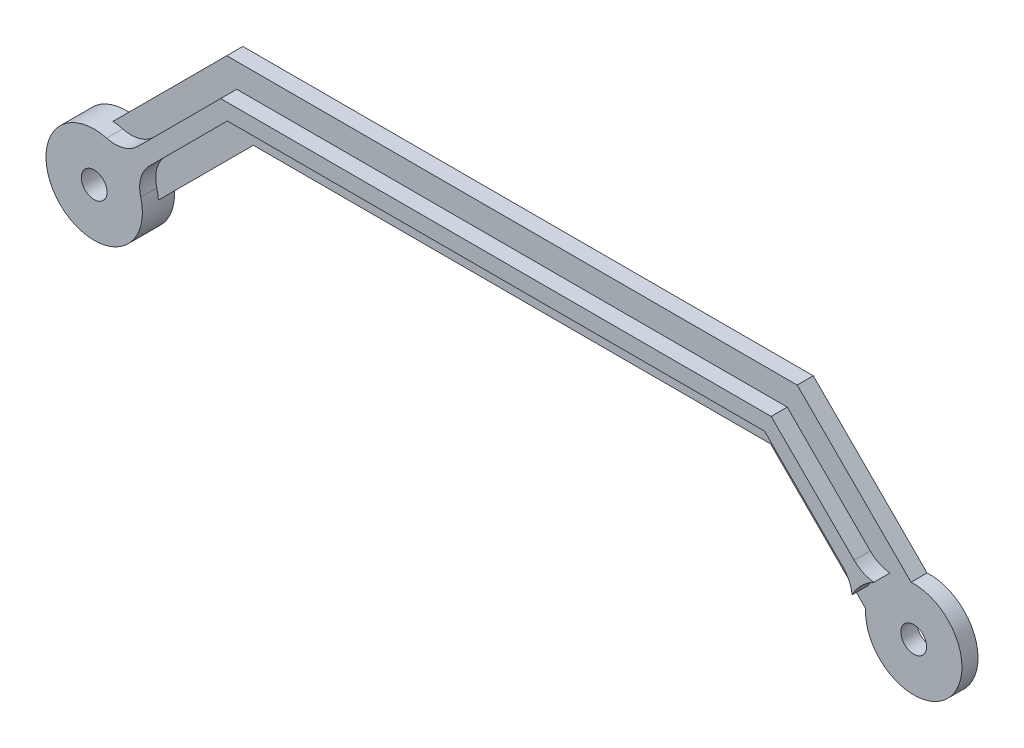
ISO-10303-21;
HEADER;
FILE_DESCRIPTION(('STEP AP214'),'2;1');
FILE_NAME('part.step','',(''),(''),'','','');
FILE_SCHEMA(('AUTOMOTIVE_DESIGN { 1 0 10303 214 1 1 1 1 }'));
ENDSEC;
DATA;
#1=APPLICATION_CONTEXT('core data for automotive mechanical design processes');
#2=APPLICATION_PROTOCOL_DEFINITION('international standard','automotive_design',2000,#1);
#3=PRODUCT_CONTEXT('',#1,'mechanical');
#4=PRODUCT('Part','Part','',(#3));
#5=PRODUCT_RELATED_PRODUCT_CATEGORY('part','',(#4));
#6=PRODUCT_DEFINITION_FORMATION('','',#4);
#7=PRODUCT_DEFINITION_CONTEXT('part definition',#1,'design');
#8=PRODUCT_DEFINITION('design','',#6,#7);
#9=PRODUCT_DEFINITION_SHAPE('','',#8);
#10=(LENGTH_UNIT() NAMED_UNIT(*) SI_UNIT(.MILLI.,.METRE.));
#11=(NAMED_UNIT(*) PLANE_ANGLE_UNIT() SI_UNIT($,.RADIAN.));
#12=(NAMED_UNIT(*) SI_UNIT($,.STERADIAN.) SOLID_ANGLE_UNIT());
#13=UNCERTAINTY_MEASURE_WITH_UNIT(LENGTH_MEASURE(1.E-05),#10,'distance_accuracy_value','');
#14=(GEOMETRIC_REPRESENTATION_CONTEXT(3) GLOBAL_UNCERTAINTY_ASSIGNED_CONTEXT((#13)) GLOBAL_UNIT_ASSIGNED_CONTEXT((#10,
#11,#12)) REPRESENTATION_CONTEXT('',''));
#15=CARTESIAN_POINT('',(0.,0.,0.));
#16=DIRECTION('',(0.,0.,1.));
#17=DIRECTION('',(1.,0.,0.));
#18=AXIS2_PLACEMENT_3D('',#15,#16,#17);
#19=CARTESIAN_POINT('',(250.,0.,5.));
#20=DIRECTION('',(0.,0.,-1.));
#21=DIRECTION('',(-1.,0.,0.));
#22=AXIS2_PLACEMENT_3D('',#19,#20,#21);
#23=CYLINDRICAL_SURFACE('',#22,15.);
#24=CARTESIAN_POINT('',(250.,0.,5.));
#25=DIRECTION('',(0.,0.,1.));
#26=DIRECTION('',(1.,0.,0.));
#27=AXIS2_PLACEMENT_3D('',#24,#25,#26);
#28=CIRCLE('',#27,15.);
#29=CARTESIAN_POINT('',(235.023238037714,0.83462633855539,5.));
#30=VERTEX_POINT('',#29);
#31=CARTESIAN_POINT('',(249.165373661444,14.9767619622864,5.));
#32=VERTEX_POINT('',#31);
#33=EDGE_CURVE('E329',#30,#32,#28,.T.);
#34=ORIENTED_EDGE('',*,*,#33,.F.);
#35=DIRECTION('',(0.,0.,-1.));
#36=VECTOR('',#35,1.);
#37=CARTESIAN_POINT('',(235.023238037714,0.83462633855539,5.));
#38=LINE('',#37,#36);
#39=CARTESIAN_POINT('',(235.023238037714,0.83462633855539,0.));
#40=VERTEX_POINT('',#39);
#41=EDGE_CURVE('E223',#30,#40,#38,.T.);
#42=ORIENTED_EDGE('',*,*,#41,.T.);
#43=CARTESIAN_POINT('',(250.,0.,0.));
#44=DIRECTION('',(0.,0.,1.));
#45=DIRECTION('',(-1.,0.,0.));
#46=AXIS2_PLACEMENT_3D('',#43,#44,#45);
#47=CIRCLE('',#46,15.);
#48=CARTESIAN_POINT('',(249.165373661444,14.9767619622864,0.));
#49=VERTEX_POINT('',#48);
#50=EDGE_CURVE('E256',#40,#49,#47,.T.);
#51=ORIENTED_EDGE('',*,*,#50,.T.);
#52=DIRECTION('',(0.,0.,-1.));
#53=VECTOR('',#52,1.);
#54=CARTESIAN_POINT('',(249.165373661444,14.9767619622864,5.));
#55=LINE('',#54,#53);
#56=EDGE_CURVE('E226',#32,#49,#55,.T.);
#57=ORIENTED_EDGE('',*,*,#56,.F.);
#58=EDGE_LOOP('',(#34,#42,#51,#57));
#59=FACE_BOUND('',#58,.T.);
#60=ADVANCED_FACE('F37',(#59),#23,.T.);
#61=CARTESIAN_POINT('',(250.,0.,5.));
#62=DIRECTION('',(0.,0.,-1.));
#63=DIRECTION('',(-1.,0.,0.));
#64=AXIS2_PLACEMENT_3D('',#61,#62,#63);
#65=CYLINDRICAL_SURFACE('',#64,3.99999999999999);
#66=CARTESIAN_POINT('',(250.,0.,0.));
#67=DIRECTION('',(0.,0.,1.));
#68=DIRECTION('',(1.,0.,0.));
#69=AXIS2_PLACEMENT_3D('',#66,#67,#68);
#70=CIRCLE('',#69,3.99999999999999);
#71=CARTESIAN_POINT('',(254.,0.,0.));
#72=VERTEX_POINT('',#71);
#73=EDGE_CURVE('E278',#72,#72,#70,.T.);
#74=ORIENTED_EDGE('',*,*,#73,.F.);
#75=EDGE_LOOP('',(#74));
#76=FACE_BOUND('',#75,.T.);
#77=CARTESIAN_POINT('',(250.,0.,5.));
#78=DIRECTION('',(0.,0.,1.));
#79=DIRECTION('',(1.,0.,0.));
#80=AXIS2_PLACEMENT_3D('',#77,#78,#79);
#81=CIRCLE('',#80,3.99999999999999);
#82=CARTESIAN_POINT('',(254.,0.,5.));
#83=VERTEX_POINT('',#82);
#84=EDGE_CURVE('E330',#83,#83,#81,.T.);
#85=ORIENTED_EDGE('',*,*,#84,.T.);
#86=EDGE_LOOP('',(#85));
#87=FACE_BOUND('',#86,.T.);
#88=ADVANCED_FACE('F413',(#76,#87),#65,.F.);
#89=CARTESIAN_POINT('',(250.,0.,5.));
#90=DIRECTION('',(0.,0.,-1.));
#91=DIRECTION('',(-1.,0.,0.));
#92=AXIS2_PLACEMENT_3D('',#89,#90,#91);
#93=PLANE('',#92);
#94=DIRECTION('',(0.707106781186551,-0.707106781186544,0.));
#95=VECTOR('',#94,1.);
#96=CARTESIAN_POINT('',(205.460749769071,30.3971146071979,5.));
#97=LINE('',#96,#95);
#98=CARTESIAN_POINT('',(205.460749769071,30.3971146071979,5.));
#99=VERTEX_POINT('',#98);
#100=EDGE_CURVE('E272',#99,#30,#97,.T.);
#101=ORIENTED_EDGE('',*,*,#100,.T.);
#102=ORIENTED_EDGE('',*,*,#33,.T.);
#103=DIRECTION('',(-0.707106781186552,0.707106781186543,0.));
#104=VECTOR('',#103,1.);
#105=CARTESIAN_POINT('',(249.165373661444,14.9767619622864,5.));
#106=LINE('',#105,#104);
#107=CARTESIAN_POINT('',(213.745021016531,50.397114607199,5.));
#108=VERTEX_POINT('',#107);
#109=EDGE_CURVE('E270',#32,#108,#106,.T.);
#110=ORIENTED_EDGE('',*,*,#109,.T.);
#111=DIRECTION('',(-1.,0.,0.));
#112=VECTOR('',#111,1.);
#113=CARTESIAN_POINT('',(36.2549789834685,50.397114607199,5.));
#114=LINE('',#113,#112);
#115=CARTESIAN_POINT('',(36.2549789834685,50.397114607199,5.));
#116=VERTEX_POINT('',#115);
#117=EDGE_CURVE('E268',#108,#116,#114,.T.);
#118=ORIENTED_EDGE('',*,*,#117,.T.);
#119=DIRECTION('',(-0.707106781186551,-0.707106781186544,0.));
#120=VECTOR('',#119,1.);
#121=CARTESIAN_POINT('',(0.834626338555555,14.9767619622864,5.));
#122=LINE('',#121,#120);
#123=CARTESIAN_POINT('',(0.834626338555554,14.9767619622864,5.));
#124=VERTEX_POINT('',#123);
#125=EDGE_CURVE('E265',#116,#124,#122,.T.);
#126=ORIENTED_EDGE('',*,*,#125,.T.);
#127=CARTESIAN_POINT('',(0.,0.,5.));
#128=DIRECTION('',(0.,0.,1.));
#129=DIRECTION('',(1.,0.,0.));
#130=AXIS2_PLACEMENT_3D('',#127,#128,#129);
#131=CIRCLE('',#130,15.);
#132=CARTESIAN_POINT('',(3.88228567653788,14.488887394336,5.));
#133=VERTEX_POINT('',#132);
#134=EDGE_CURVE('E322',#133,#124,#131,.T.);
#135=ORIENTED_EDGE('',*,*,#134,.F.);
#136=CARTESIAN_POINT('',(6.47047612756314,24.1481456572267,5.));
#137=DIRECTION('',(0.,0.,-1.));
#138=DIRECTION('',(-1.,0.,0.));
#139=AXIS2_PLACEMENT_3D('',#136,#137,#138);
#140=CIRCLE('',#139,10.);
#141=CARTESIAN_POINT('',(13.5415439394286,17.0770778453612,5.));
#142=VERTEX_POINT('',#141);
#143=EDGE_CURVE('E211',#133,#142,#140,.F.);
#144=ORIENTED_EDGE('',*,*,#143,.T.);
#145=DIRECTION('',(-0.707106781186551,-0.707106781186544,0.));
#146=VECTOR('',#145,1.);
#147=CARTESIAN_POINT('',(39.3615807012659,42.8971146071982,5.));
#148=LINE('',#147,#146);
#149=CARTESIAN_POINT('',(39.3615807012659,42.8971146071982,5.));
#150=VERTEX_POINT('',#149);
#151=EDGE_CURVE('E302',#150,#142,#148,.T.);
#152=ORIENTED_EDGE('',*,*,#151,.F.);
#153=DIRECTION('',(-1.,0.,0.));
#154=VECTOR('',#153,1.);
#155=CARTESIAN_POINT('',(210.638419298733,42.897114607199,5.));
#156=LINE('',#155,#154);
#157=CARTESIAN_POINT('',(210.638419298733,42.897114607199,5.));
#158=VERTEX_POINT('',#157);
#159=EDGE_CURVE('E304',#158,#150,#156,.T.);
#160=ORIENTED_EDGE('',*,*,#159,.F.);
#161=DIRECTION('',(-0.707106781186552,0.707106781186543,0.));
#162=VECTOR('',#161,1.);
#163=CARTESIAN_POINT('',(243.862072802545,9.67346110338729,5.));
#164=LINE('',#163,#162);
#165=CARTESIAN_POINT('',(236.458456060571,17.0770778453612,5.));
#166=VERTEX_POINT('',#165);
#167=EDGE_CURVE('E306',#166,#158,#164,.T.);
#168=ORIENTED_EDGE('',*,*,#167,.F.);
#169=CARTESIAN_POINT('',(243.529523872437,24.1481456572267,5.));
#170=DIRECTION('',(0.,0.,-1.));
#171=DIRECTION('',(-1.,0.,0.));
#172=AXIS2_PLACEMENT_3D('',#169,#170,#171);
#173=CIRCLE('',#172,10.);
#174=CARTESIAN_POINT('',(242.609007064555,14.1906033496888,5.));
#175=VERTEX_POINT('',#174);
#176=EDGE_CURVE('E209',#166,#175,#173,.F.);
#177=ORIENTED_EDGE('',*,*,#176,.T.);
#178=CARTESIAN_POINT('',(250.,0.,5.));
#179=DIRECTION('',(0.,0.,1.));
#180=DIRECTION('',(1.,0.,0.));
#181=AXIS2_PLACEMENT_3D('',#178,#179,#180);
#182=CIRCLE('',#181,16.);
#183=CARTESIAN_POINT('',(235.809396650311,7.39099293544512,5.));
#184=VERTEX_POINT('',#183);
#185=EDGE_CURVE('E178',#175,#184,#182,.T.);
#186=ORIENTED_EDGE('',*,*,#185,.T.);
#187=CARTESIAN_POINT('',(225.851854342773,6.47047612756288,5.));
#188=DIRECTION('',(0.,0.,-1.));
#189=DIRECTION('',(-1.,0.,0.));
#190=AXIS2_PLACEMENT_3D('',#187,#188,#189);
#191=CIRCLE('',#190,10.);
#192=CARTESIAN_POINT('',(232.922922154639,13.5415439394284,5.));
#193=VERTEX_POINT('',#192);
#194=EDGE_CURVE('E216',#184,#193,#191,.F.);
#195=ORIENTED_EDGE('',*,*,#194,.T.);
#196=DIRECTION('',(0.707106781186551,-0.707106781186544,0.));
#197=VECTOR('',#196,1.);
#198=CARTESIAN_POINT('',(208.567351486869,37.8971146071979,5.));
#199=LINE('',#198,#197);
#200=CARTESIAN_POINT('',(208.567351486869,37.8971146071979,5.));
#201=VERTEX_POINT('',#200);
#202=EDGE_CURVE('E294',#201,#193,#199,.T.);
#203=ORIENTED_EDGE('',*,*,#202,.F.);
#204=DIRECTION('',(1.,0.,0.));
#205=VECTOR('',#204,1.);
#206=CARTESIAN_POINT('',(41.4326485131319,37.8971146071987,5.));
#207=LINE('',#206,#205);
#208=CARTESIAN_POINT('',(41.4326485131319,37.8971146071987,5.));
#209=VERTEX_POINT('',#208);
#210=EDGE_CURVE('E298',#209,#201,#207,.T.);
#211=ORIENTED_EDGE('',*,*,#210,.F.);
#212=DIRECTION('',(0.707106781186551,0.707106781186544,0.));
#213=VECTOR('',#212,1.);
#214=CARTESIAN_POINT('',(9.67346110338735,6.13792719745452,5.));
#215=LINE('',#214,#213);
#216=CARTESIAN_POINT('',(17.0770778453613,13.5415439394284,5.));
#217=VERTEX_POINT('',#216);
#218=EDGE_CURVE('E300',#217,#209,#215,.T.);
#219=ORIENTED_EDGE('',*,*,#218,.F.);
#220=CARTESIAN_POINT('',(24.1481456572267,6.47047612756288,5.));
#221=DIRECTION('',(0.,0.,-1.));
#222=DIRECTION('',(-1.,0.,0.));
#223=AXIS2_PLACEMENT_3D('',#220,#221,#222);
#224=CIRCLE('',#223,10.);
#225=CARTESIAN_POINT('',(14.488887394336,3.88228567653773,5.));
#226=VERTEX_POINT('',#225);
#227=EDGE_CURVE('E218',#217,#226,#224,.F.);
#228=ORIENTED_EDGE('',*,*,#227,.T.);
#229=CARTESIAN_POINT('',(14.9767619622864,0.834626338555396,5.));
#230=VERTEX_POINT('',#229);
#231=EDGE_CURVE('E319',#230,#226,#131,.T.);
#232=ORIENTED_EDGE('',*,*,#231,.F.);
#233=DIRECTION('',(0.707106781186551,0.707106781186544,0.));
#234=VECTOR('',#233,1.);
#235=CARTESIAN_POINT('',(44.5392502309292,30.3971146071979,5.));
#236=LINE('',#235,#234);
#237=CARTESIAN_POINT('',(44.5392502309292,30.3971146071979,5.));
#238=VERTEX_POINT('',#237);
#239=EDGE_CURVE('E244',#230,#238,#236,.T.);
#240=ORIENTED_EDGE('',*,*,#239,.T.);
#241=DIRECTION('',(1.,0.,0.));
#242=VECTOR('',#241,1.);
#243=CARTESIAN_POINT('',(44.5392502309292,30.3971146071979,5.));
#244=LINE('',#243,#242);
#245=EDGE_CURVE('E247',#238,#99,#244,.T.);
#246=ORIENTED_EDGE('',*,*,#245,.T.);
#247=EDGE_LOOP('',(#101,#102,#110,#118,#126,#135,#144,#152,#160,#168,#177,#186,#195,#203,#211,
#219,#228,#232,#240,#246));
#248=FACE_BOUND('',#247,.T.);
#249=ORIENTED_EDGE('',*,*,#84,.F.);
#250=EDGE_LOOP('',(#249));
#251=FACE_BOUND('',#250,.T.);
#252=ADVANCED_FACE('F336',(#248,#251),#93,.F.);
#253=CARTESIAN_POINT('',(243.862072802545,9.67346110338729,10.));
#254=DIRECTION('',(-0.707106781186543,-0.707106781186552,0.));
#255=DIRECTION('',(0.707106781186552,-0.707106781186543,0.));
#256=AXIS2_PLACEMENT_3D('',#253,#254,#255);
#257=PLANE('',#256);
#258=DIRECTION('',(-0.707106781186552,0.707106781186543,0.));
#259=VECTOR('',#258,1.);
#260=CARTESIAN_POINT('',(243.862072802545,9.67346110338729,10.));
#261=LINE('',#260,#259);
#262=CARTESIAN_POINT('',(236.458456060571,17.0770778453612,10.));
#263=VERTEX_POINT('',#262);
#264=CARTESIAN_POINT('',(210.638419298733,42.897114607199,10.));
#265=VERTEX_POINT('',#264);
#266=EDGE_CURVE('E297',#263,#265,#261,.T.);
#267=ORIENTED_EDGE('',*,*,#266,.F.);
#268=DIRECTION('',(0.,0.,1.));
#269=VECTOR('',#268,1.);
#270=CARTESIAN_POINT('',(236.458456060571,17.0770778453612,5.));
#271=LINE('',#270,#269);
#272=EDGE_CURVE('E194',#263,#166,#271,.F.);
#273=ORIENTED_EDGE('',*,*,#272,.T.);
#274=ORIENTED_EDGE('',*,*,#167,.T.);
#275=DIRECTION('',(0.,0.,-1.));
#276=VECTOR('',#275,1.);
#277=CARTESIAN_POINT('',(210.638419298733,42.897114607199,10.));
#278=LINE('',#277,#276);
#279=EDGE_CURVE('E281',#265,#158,#278,.T.);
#280=ORIENTED_EDGE('',*,*,#279,.F.);
#281=EDGE_LOOP('',(#267,#273,#274,#280));
#282=FACE_BOUND('',#281,.T.);
#283=ADVANCED_FACE('F444',(#282),#257,.F.);
#284=CARTESIAN_POINT('',(208.567351486869,37.8971146071979,10.));
#285=DIRECTION('',(0.707106781186544,0.707106781186551,0.));
#286=DIRECTION('',(-0.707106781186551,0.707106781186544,0.));
#287=AXIS2_PLACEMENT_3D('',#284,#285,#286);
#288=PLANE('',#287);
#289=ORIENTED_EDGE('',*,*,#202,.T.);
#290=DIRECTION('',(0.,0.,1.));
#291=VECTOR('',#290,1.);
#292=CARTESIAN_POINT('',(232.922922154639,13.5415439394284,10.));
#293=LINE('',#292,#291);
#294=CARTESIAN_POINT('',(232.922922154639,13.5415439394284,10.));
#295=VERTEX_POINT('',#294);
#296=EDGE_CURVE('E214',#193,#295,#293,.T.);
#297=ORIENTED_EDGE('',*,*,#296,.T.);
#298=DIRECTION('',(0.707106781186551,-0.707106781186544,0.));
#299=VECTOR('',#298,1.);
#300=CARTESIAN_POINT('',(208.567351486869,37.8971146071979,10.));
#301=LINE('',#300,#299);
#302=CARTESIAN_POINT('',(208.567351486869,37.8971146071979,10.));
#303=VERTEX_POINT('',#302);
#304=EDGE_CURVE('E293',#303,#295,#301,.T.);
#305=ORIENTED_EDGE('',*,*,#304,.F.);
#306=DIRECTION('',(0.,0.,-1.));
#307=VECTOR('',#306,1.);
#308=CARTESIAN_POINT('',(208.567351486869,37.8971146071979,10.));
#309=LINE('',#308,#307);
#310=EDGE_CURVE('E290',#303,#201,#309,.T.);
#311=ORIENTED_EDGE('',*,*,#310,.T.);
#312=EDGE_LOOP('',(#289,#297,#305,#311));
#313=FACE_BOUND('',#312,.T.);
#314=ADVANCED_FACE('F345',(#313),#288,.F.);
#315=CARTESIAN_POINT('',(39.3615807012659,42.8971146071982,10.));
#316=DIRECTION('',(0.707106781186544,-0.707106781186551,0.));
#317=DIRECTION('',(0.707106781186551,0.707106781186544,0.));
#318=AXIS2_PLACEMENT_3D('',#315,#316,#317);
#319=PLANE('',#318);
#320=ORIENTED_EDGE('',*,*,#151,.T.);
#321=DIRECTION('',(0.,0.,1.));
#322=VECTOR('',#321,1.);
#323=CARTESIAN_POINT('',(13.5415439394286,17.0770778453612,10.));
#324=LINE('',#323,#322);
#325=CARTESIAN_POINT('',(13.5415439394286,17.0770778453612,10.));
#326=VERTEX_POINT('',#325);
#327=EDGE_CURVE('E59',#142,#326,#324,.T.);
#328=ORIENTED_EDGE('',*,*,#327,.T.);
#329=DIRECTION('',(-0.707106781186551,-0.707106781186544,0.));
#330=VECTOR('',#329,1.);
#331=CARTESIAN_POINT('',(39.3615807012659,42.8971146071982,10.));
#332=LINE('',#331,#330);
#333=CARTESIAN_POINT('',(39.3615807012659,42.8971146071982,10.));
#334=VERTEX_POINT('',#333);
#335=EDGE_CURVE('E314',#334,#326,#332,.T.);
#336=ORIENTED_EDGE('',*,*,#335,.F.);
#337=DIRECTION('',(0.,0.,-1.));
#338=VECTOR('',#337,1.);
#339=CARTESIAN_POINT('',(39.3615807012659,42.8971146071982,10.));
#340=LINE('',#339,#338);
#341=EDGE_CURVE('E284',#334,#150,#340,.T.);
#342=ORIENTED_EDGE('',*,*,#341,.T.);
#343=EDGE_LOOP('',(#320,#328,#336,#342));
#344=FACE_BOUND('',#343,.T.);
#345=ADVANCED_FACE('F443',(#344),#319,.F.);
#346=CARTESIAN_POINT('',(9.67346110338735,6.13792719745452,10.));
#347=DIRECTION('',(-0.707106781186544,0.707106781186551,0.));
#348=DIRECTION('',(-0.707106781186551,-0.707106781186544,0.));
#349=AXIS2_PLACEMENT_3D('',#346,#347,#348);
#350=PLANE('',#349);
#351=DIRECTION('',(0.707106781186551,0.707106781186544,0.));
#352=VECTOR('',#351,1.);
#353=CARTESIAN_POINT('',(9.67346110338735,6.13792719745452,10.));
#354=LINE('',#353,#352);
#355=CARTESIAN_POINT('',(17.0770778453613,13.5415439394284,10.));
#356=VERTEX_POINT('',#355);
#357=CARTESIAN_POINT('',(41.4326485131319,37.8971146071987,10.));
#358=VERTEX_POINT('',#357);
#359=EDGE_CURVE('E312',#356,#358,#354,.T.);
#360=ORIENTED_EDGE('',*,*,#359,.F.);
#361=DIRECTION('',(0.,0.,1.));
#362=VECTOR('',#361,1.);
#363=CARTESIAN_POINT('',(17.0770778453613,13.5415439394284,5.));
#364=LINE('',#363,#362);
#365=EDGE_CURVE('E198',#356,#217,#364,.F.);
#366=ORIENTED_EDGE('',*,*,#365,.T.);
#367=ORIENTED_EDGE('',*,*,#218,.T.);
#368=DIRECTION('',(0.,0.,-1.));
#369=VECTOR('',#368,1.);
#370=CARTESIAN_POINT('',(41.4326485131319,37.8971146071987,10.));
#371=LINE('',#370,#369);
#372=EDGE_CURVE('E287',#358,#209,#371,.T.);
#373=ORIENTED_EDGE('',*,*,#372,.F.);
#374=EDGE_LOOP('',(#360,#366,#367,#373));
#375=FACE_BOUND('',#374,.T.);
#376=ADVANCED_FACE('F448',(#375),#350,.F.);
#377=CARTESIAN_POINT('',(250.,0.,0.));
#378=DIRECTION('',(0.,0.,-1.));
#379=DIRECTION('',(-1.,0.,0.));
#380=AXIS2_PLACEMENT_3D('',#377,#378,#379);
#381=PLANE('',#380);
#382=CARTESIAN_POINT('',(0.,0.,0.));
#383=DIRECTION('',(0.,0.,1.));
#384=DIRECTION('',(1.,0.,0.));
#385=AXIS2_PLACEMENT_3D('',#382,#383,#384);
#386=CIRCLE('',#385,4.);
#387=CARTESIAN_POINT('',(4.,0.,0.));
#388=VERTEX_POINT('',#387);
#389=EDGE_CURVE('E263',#388,#388,#386,.T.);
#390=ORIENTED_EDGE('',*,*,#389,.T.);
#391=EDGE_LOOP('',(#390));
#392=FACE_BOUND('',#391,.T.);
#393=DIRECTION('',(1.,0.,0.));
#394=VECTOR('',#393,1.);
#395=CARTESIAN_POINT('',(44.5392502309292,30.3971146071979,0.));
#396=LINE('',#395,#394);
#397=CARTESIAN_POINT('',(44.5392502309292,30.3971146071979,0.));
#398=VERTEX_POINT('',#397);
#399=CARTESIAN_POINT('',(205.460749769071,30.3971146071979,0.));
#400=VERTEX_POINT('',#399);
#401=EDGE_CURVE('E260',#398,#400,#396,.T.);
#402=ORIENTED_EDGE('',*,*,#401,.F.);
#403=DIRECTION('',(0.707106781186551,0.707106781186544,0.));
#404=VECTOR('',#403,1.);
#405=CARTESIAN_POINT('',(44.5392502309292,30.3971146071979,0.));
#406=LINE('',#405,#404);
#407=CARTESIAN_POINT('',(14.9767619622864,0.834626338555396,0.));
#408=VERTEX_POINT('',#407);
#409=EDGE_CURVE('E245',#408,#398,#406,.T.);
#410=ORIENTED_EDGE('',*,*,#409,.F.);
#411=CARTESIAN_POINT('',(0.,0.,0.));
#412=DIRECTION('',(0.,0.,1.));
#413=DIRECTION('',(1.,0.,0.));
#414=AXIS2_PLACEMENT_3D('',#411,#412,#413);
#415=CIRCLE('',#414,15.);
#416=CARTESIAN_POINT('',(0.834626338555554,14.9767619622864,0.));
#417=VERTEX_POINT('',#416);
#418=EDGE_CURVE('E248',#417,#408,#415,.T.);
#419=ORIENTED_EDGE('',*,*,#418,.F.);
#420=DIRECTION('',(-0.707106781186551,-0.707106781186544,0.));
#421=VECTOR('',#420,1.);
#422=CARTESIAN_POINT('',(0.834626338555555,14.9767619622864,0.));
#423=LINE('',#422,#421);
#424=CARTESIAN_POINT('',(36.2549789834685,50.397114607199,0.));
#425=VERTEX_POINT('',#424);
#426=EDGE_CURVE('E250',#425,#417,#423,.T.);
#427=ORIENTED_EDGE('',*,*,#426,.F.);
#428=DIRECTION('',(-1.,0.,0.));
#429=VECTOR('',#428,1.);
#430=CARTESIAN_POINT('',(36.2549789834685,50.397114607199,0.));
#431=LINE('',#430,#429);
#432=CARTESIAN_POINT('',(213.745021016531,50.397114607199,0.));
#433=VERTEX_POINT('',#432);
#434=EDGE_CURVE('E252',#433,#425,#431,.T.);
#435=ORIENTED_EDGE('',*,*,#434,.F.);
#436=DIRECTION('',(-0.707106781186552,0.707106781186543,0.));
#437=VECTOR('',#436,1.);
#438=CARTESIAN_POINT('',(249.165373661444,14.9767619622864,0.));
#439=LINE('',#438,#437);
#440=EDGE_CURVE('E254',#49,#433,#439,.T.);
#441=ORIENTED_EDGE('',*,*,#440,.F.);
#442=ORIENTED_EDGE('',*,*,#50,.F.);
#443=DIRECTION('',(0.707106781186551,-0.707106781186544,0.));
#444=VECTOR('',#443,1.);
#445=CARTESIAN_POINT('',(205.460749769071,30.3971146071979,0.));
#446=LINE('',#445,#444);
#447=EDGE_CURVE('E258',#400,#40,#446,.T.);
#448=ORIENTED_EDGE('',*,*,#447,.F.);
#449=EDGE_LOOP('',(#402,#410,#419,#427,#435,#441,#442,#448));
#450=FACE_BOUND('',#449,.T.);
#451=ORIENTED_EDGE('',*,*,#73,.T.);
#452=EDGE_LOOP('',(#451));
#453=FACE_BOUND('',#452,.T.);
#454=ADVANCED_FACE('F379',(#392,#450,#453),#381,.T.);
#455=CARTESIAN_POINT('',(44.5392502309292,30.3971146071979,5.));
#456=DIRECTION('',(0.,1.,0.));
#457=DIRECTION('',(-1.,0.,0.));
#458=AXIS2_PLACEMENT_3D('',#455,#456,#457);
#459=PLANE('',#458);
#460=ORIENTED_EDGE('',*,*,#401,.T.);
#461=DIRECTION('',(0.,0.,-1.));
#462=VECTOR('',#461,1.);
#463=CARTESIAN_POINT('',(205.460749769071,30.3971146071979,5.));
#464=LINE('',#463,#462);
#465=EDGE_CURVE('E220',#99,#400,#464,.T.);
#466=ORIENTED_EDGE('',*,*,#465,.F.);
#467=ORIENTED_EDGE('',*,*,#245,.F.);
#468=DIRECTION('',(0.,0.,-1.));
#469=VECTOR('',#468,1.);
#470=CARTESIAN_POINT('',(44.5392502309292,30.3971146071979,5.));
#471=LINE('',#470,#469);
#472=EDGE_CURVE('E241',#238,#398,#471,.T.);
#473=ORIENTED_EDGE('',*,*,#472,.T.);
#474=EDGE_LOOP('',(#460,#466,#467,#473));
#475=FACE_BOUND('',#474,.T.);
#476=ADVANCED_FACE('F388',(#475),#459,.F.);
#477=CARTESIAN_POINT('',(205.460749769071,30.3971146071979,5.));
#478=DIRECTION('',(0.707106781186544,0.707106781186551,0.));
#479=DIRECTION('',(-0.707106781186551,0.707106781186544,0.));
#480=AXIS2_PLACEMENT_3D('',#477,#478,#479);
#481=PLANE('',#480);
#482=ORIENTED_EDGE('',*,*,#447,.T.);
#483=ORIENTED_EDGE('',*,*,#41,.F.);
#484=ORIENTED_EDGE('',*,*,#100,.F.);
#485=ORIENTED_EDGE('',*,*,#465,.T.);
#486=EDGE_LOOP('',(#482,#483,#484,#485));
#487=FACE_BOUND('',#486,.T.);
#488=ADVANCED_FACE('F397',(#487),#481,.F.);
#489=CARTESIAN_POINT('',(249.165373661444,14.9767619622864,5.));
#490=DIRECTION('',(-0.707106781186543,-0.707106781186552,0.));
#491=DIRECTION('',(0.707106781186552,-0.707106781186543,0.));
#492=AXIS2_PLACEMENT_3D('',#489,#490,#491);
#493=PLANE('',#492);
#494=ORIENTED_EDGE('',*,*,#440,.T.);
#495=DIRECTION('',(0.,0.,-1.));
#496=VECTOR('',#495,1.);
#497=CARTESIAN_POINT('',(213.745021016531,50.397114607199,5.));
#498=LINE('',#497,#496);
#499=EDGE_CURVE('E229',#108,#433,#498,.T.);
#500=ORIENTED_EDGE('',*,*,#499,.F.);
#501=ORIENTED_EDGE('',*,*,#109,.F.);
#502=ORIENTED_EDGE('',*,*,#56,.T.);
#503=EDGE_LOOP('',(#494,#500,#501,#502));
#504=FACE_BOUND('',#503,.T.);
#505=ADVANCED_FACE('F400',(#504),#493,.F.);
#506=CARTESIAN_POINT('',(36.2549789834685,50.397114607199,5.));
#507=DIRECTION('',(0.,-1.,0.));
#508=DIRECTION('',(0.,0.,-1.));
#509=AXIS2_PLACEMENT_3D('',#506,#507,#508);
#510=PLANE('',#509);
#511=ORIENTED_EDGE('',*,*,#434,.T.);
#512=DIRECTION('',(0.,0.,-1.));
#513=VECTOR('',#512,1.);
#514=CARTESIAN_POINT('',(36.2549789834685,50.397114607199,5.));
#515=LINE('',#514,#513);
#516=EDGE_CURVE('E232',#116,#425,#515,.T.);
#517=ORIENTED_EDGE('',*,*,#516,.F.);
#518=ORIENTED_EDGE('',*,*,#117,.F.);
#519=ORIENTED_EDGE('',*,*,#499,.T.);
#520=EDGE_LOOP('',(#511,#517,#518,#519));
#521=FACE_BOUND('',#520,.T.);
#522=ADVANCED_FACE('F403',(#521),#510,.F.);
#523=CARTESIAN_POINT('',(0.834626338555555,14.9767619622864,5.));
#524=DIRECTION('',(0.707106781186544,-0.707106781186551,0.));
#525=DIRECTION('',(0.707106781186551,0.707106781186544,0.));
#526=AXIS2_PLACEMENT_3D('',#523,#524,#525);
#527=PLANE('',#526);
#528=ORIENTED_EDGE('',*,*,#426,.T.);
#529=DIRECTION('',(0.,0.,-1.));
#530=VECTOR('',#529,1.);
#531=CARTESIAN_POINT('',(0.834626338555554,14.9767619622864,5.));
#532=LINE('',#531,#530);
#533=EDGE_CURVE('E235',#124,#417,#532,.T.);
#534=ORIENTED_EDGE('',*,*,#533,.F.);
#535=ORIENTED_EDGE('',*,*,#125,.F.);
#536=ORIENTED_EDGE('',*,*,#516,.T.);
#537=EDGE_LOOP('',(#528,#534,#535,#536));
#538=FACE_BOUND('',#537,.T.);
#539=ADVANCED_FACE('F373',(#538),#527,.F.);
#540=CARTESIAN_POINT('',(0.,0.,5.));
#541=DIRECTION('',(0.,0.,-1.));
#542=DIRECTION('',(-1.,0.,0.));
#543=AXIS2_PLACEMENT_3D('',#540,#541,#542);
#544=CYLINDRICAL_SURFACE('',#543,15.);
#545=CARTESIAN_POINT('',(0.,0.,10.));
#546=DIRECTION('',(0.,0.,1.));
#547=DIRECTION('',(1.,0.,0.));
#548=AXIS2_PLACEMENT_3D('',#545,#546,#547);
#549=CIRCLE('',#548,15.);
#550=CARTESIAN_POINT('',(3.88228567653788,14.488887394336,10.));
#551=VERTEX_POINT('',#550);
#552=CARTESIAN_POINT('',(14.488887394336,3.88228567653773,10.));
#553=VERTEX_POINT('',#552);
#554=EDGE_CURVE('E308',#551,#553,#549,.T.);
#555=ORIENTED_EDGE('',*,*,#554,.F.);
#556=DIRECTION('',(0.,0.,-1.));
#557=VECTOR('',#556,1.);
#558=CARTESIAN_POINT('',(3.88228567653788,14.488887394336,5.));
#559=LINE('',#558,#557);
#560=EDGE_CURVE('E203',#551,#133,#559,.T.);
#561=ORIENTED_EDGE('',*,*,#560,.T.);
#562=ORIENTED_EDGE('',*,*,#134,.T.);
#563=ORIENTED_EDGE('',*,*,#533,.T.);
#564=ORIENTED_EDGE('',*,*,#418,.T.);
#565=DIRECTION('',(0.,0.,-1.));
#566=VECTOR('',#565,1.);
#567=CARTESIAN_POINT('',(14.9767619622864,0.834626338555396,5.));
#568=LINE('',#567,#566);
#569=EDGE_CURVE('E238',#230,#408,#568,.T.);
#570=ORIENTED_EDGE('',*,*,#569,.F.);
#571=ORIENTED_EDGE('',*,*,#231,.T.);
#572=DIRECTION('',(0.,0.,-1.));
#573=VECTOR('',#572,1.);
#574=CARTESIAN_POINT('',(14.488887394336,3.88228567653773,5.));
#575=LINE('',#574,#573);
#576=EDGE_CURVE('E206',#226,#553,#575,.F.);
#577=ORIENTED_EDGE('',*,*,#576,.T.);
#578=EDGE_LOOP('',(#555,#561,#562,#563,#564,#570,#571,#577));
#579=FACE_BOUND('',#578,.T.);
#580=ADVANCED_FACE('F360',(#579),#544,.T.);
#581=CARTESIAN_POINT('',(44.5392502309292,30.3971146071979,5.));
#582=DIRECTION('',(-0.707106781186544,0.707106781186551,0.));
#583=DIRECTION('',(-0.707106781186551,-0.707106781186544,0.));
#584=AXIS2_PLACEMENT_3D('',#581,#582,#583);
#585=PLANE('',#584);
#586=ORIENTED_EDGE('',*,*,#409,.T.);
#587=ORIENTED_EDGE('',*,*,#472,.F.);
#588=ORIENTED_EDGE('',*,*,#239,.F.);
#589=ORIENTED_EDGE('',*,*,#569,.T.);
#590=EDGE_LOOP('',(#586,#587,#588,#589));
#591=FACE_BOUND('',#590,.T.);
#592=ADVANCED_FACE('F384',(#591),#585,.F.);
#593=CARTESIAN_POINT('',(0.,0.,5.));
#594=DIRECTION('',(0.,0.,-1.));
#595=DIRECTION('',(-1.,0.,0.));
#596=AXIS2_PLACEMENT_3D('',#593,#594,#595);
#597=CYLINDRICAL_SURFACE('',#596,4.);
#598=ORIENTED_EDGE('',*,*,#389,.F.);
#599=EDGE_LOOP('',(#598));
#600=FACE_BOUND('',#599,.T.);
#601=CARTESIAN_POINT('',(0.,0.,10.));
#602=DIRECTION('',(0.,0.,1.));
#603=DIRECTION('',(1.,0.,0.));
#604=AXIS2_PLACEMENT_3D('',#601,#602,#603);
#605=CIRCLE('',#604,4.);
#606=CARTESIAN_POINT('',(4.,0.,10.));
#607=VERTEX_POINT('',#606);
#608=EDGE_CURVE('E324',#607,#607,#605,.T.);
#609=ORIENTED_EDGE('',*,*,#608,.T.);
#610=EDGE_LOOP('',(#609));
#611=FACE_BOUND('',#610,.T.);
#612=ADVANCED_FACE('F455',(#600,#611),#597,.F.);
#613=CARTESIAN_POINT('',(210.638419298733,42.897114607199,10.));
#614=DIRECTION('',(0.,-1.,0.));
#615=DIRECTION('',(1.,0.,0.));
#616=AXIS2_PLACEMENT_3D('',#613,#614,#615);
#617=PLANE('',#616);
#618=ORIENTED_EDGE('',*,*,#159,.T.);
#619=ORIENTED_EDGE('',*,*,#341,.F.);
#620=DIRECTION('',(-1.,0.,0.));
#621=VECTOR('',#620,1.);
#622=CARTESIAN_POINT('',(210.638419298733,42.897114607199,10.));
#623=LINE('',#622,#621);
#624=EDGE_CURVE('E316',#265,#334,#623,.T.);
#625=ORIENTED_EDGE('',*,*,#624,.F.);
#626=ORIENTED_EDGE('',*,*,#279,.T.);
#627=EDGE_LOOP('',(#618,#619,#625,#626));
#628=FACE_BOUND('',#627,.T.);
#629=ADVANCED_FACE('F447',(#628),#617,.F.);
#630=CARTESIAN_POINT('',(41.4326485131319,37.8971146071987,10.));
#631=DIRECTION('',(0.,1.,0.));
#632=DIRECTION('',(-1.,0.,0.));
#633=AXIS2_PLACEMENT_3D('',#630,#631,#632);
#634=PLANE('',#633);
#635=ORIENTED_EDGE('',*,*,#210,.T.);
#636=ORIENTED_EDGE('',*,*,#310,.F.);
#637=DIRECTION('',(1.,0.,0.));
#638=VECTOR('',#637,1.);
#639=CARTESIAN_POINT('',(41.4326485131319,37.8971146071987,10.));
#640=LINE('',#639,#638);
#641=EDGE_CURVE('E310',#358,#303,#640,.T.);
#642=ORIENTED_EDGE('',*,*,#641,.F.);
#643=ORIENTED_EDGE('',*,*,#372,.T.);
#644=EDGE_LOOP('',(#635,#636,#642,#643));
#645=FACE_BOUND('',#644,.T.);
#646=ADVANCED_FACE('F350',(#645),#634,.F.);
#647=CARTESIAN_POINT('',(0.,0.,10.));
#648=DIRECTION('',(0.,0.,1.));
#649=DIRECTION('',(1.,0.,0.));
#650=AXIS2_PLACEMENT_3D('',#647,#648,#649);
#651=PLANE('',#650);
#652=CARTESIAN_POINT('',(250.,0.,10.));
#653=DIRECTION('',(0.,0.,1.));
#654=DIRECTION('',(1.,0.,0.));
#655=AXIS2_PLACEMENT_3D('',#652,#653,#654);
#656=CIRCLE('',#655,16.);
#657=CARTESIAN_POINT('',(242.609007064555,14.1906033496888,10.));
#658=VERTEX_POINT('',#657);
#659=CARTESIAN_POINT('',(235.809396650311,7.39099293544512,10.));
#660=VERTEX_POINT('',#659);
#661=EDGE_CURVE('E175',#658,#660,#656,.T.);
#662=ORIENTED_EDGE('',*,*,#661,.F.);
#663=CARTESIAN_POINT('',(243.529523872437,24.1481456572267,10.));
#664=DIRECTION('',(0.,0.,1.));
#665=DIRECTION('',(1.,0.,0.));
#666=AXIS2_PLACEMENT_3D('',#663,#664,#665);
#667=CIRCLE('',#666,10.);
#668=EDGE_CURVE('E186',#658,#263,#667,.F.);
#669=ORIENTED_EDGE('',*,*,#668,.T.);
#670=ORIENTED_EDGE('',*,*,#266,.T.);
#671=ORIENTED_EDGE('',*,*,#624,.T.);
#672=ORIENTED_EDGE('',*,*,#335,.T.);
#673=CARTESIAN_POINT('',(6.47047612756314,24.1481456572267,10.));
#674=DIRECTION('',(0.,0.,1.));
#675=DIRECTION('',(1.,0.,0.));
#676=AXIS2_PLACEMENT_3D('',#673,#674,#675);
#677=CIRCLE('',#676,10.);
#678=EDGE_CURVE('E195',#326,#551,#677,.F.);
#679=ORIENTED_EDGE('',*,*,#678,.T.);
#680=ORIENTED_EDGE('',*,*,#554,.T.);
#681=CARTESIAN_POINT('',(24.1481456572267,6.47047612756288,10.));
#682=DIRECTION('',(0.,0.,1.));
#683=DIRECTION('',(1.,0.,0.));
#684=AXIS2_PLACEMENT_3D('',#681,#682,#683);
#685=CIRCLE('',#684,10.);
#686=EDGE_CURVE('E45',#553,#356,#685,.F.);
#687=ORIENTED_EDGE('',*,*,#686,.T.);
#688=ORIENTED_EDGE('',*,*,#359,.T.);
#689=ORIENTED_EDGE('',*,*,#641,.T.);
#690=ORIENTED_EDGE('',*,*,#304,.T.);
#691=CARTESIAN_POINT('',(225.851854342773,6.47047612756288,10.));
#692=DIRECTION('',(0.,0.,1.));
#693=DIRECTION('',(1.,0.,0.));
#694=AXIS2_PLACEMENT_3D('',#691,#692,#693);
#695=CIRCLE('',#694,10.);
#696=EDGE_CURVE('E190',#295,#660,#695,.F.);
#697=ORIENTED_EDGE('',*,*,#696,.T.);
#698=EDGE_LOOP('',(#662,#669,#670,#671,#672,#679,#680,#687,#688,#689,#690,#697));
#699=FACE_BOUND('',#698,.T.);
#700=ORIENTED_EDGE('',*,*,#608,.F.);
#701=EDGE_LOOP('',(#700));
#702=FACE_BOUND('',#701,.T.);
#703=ADVANCED_FACE('F184',(#699,#702),#651,.T.);
#704=CARTESIAN_POINT('',(225.851854342773,6.47047612756288,5.));
#705=DIRECTION('',(0.,0.,-1.));
#706=DIRECTION('',(-1.,0.,0.));
#707=AXIS2_PLACEMENT_3D('',#704,#705,#706);
#708=CYLINDRICAL_SURFACE('',#707,10.);
#709=ORIENTED_EDGE('',*,*,#194,.F.);
#710=DIRECTION('',(0.,0.,1.));
#711=VECTOR('',#710,1.);
#712=CARTESIAN_POINT('',(235.809396650311,7.39099293544512,7.5));
#713=LINE('',#712,#711);
#714=EDGE_CURVE('E327',#184,#660,#713,.T.);
#715=ORIENTED_EDGE('',*,*,#714,.T.);
#716=ORIENTED_EDGE('',*,*,#696,.F.);
#717=ORIENTED_EDGE('',*,*,#296,.F.);
#718=EDGE_LOOP('',(#709,#715,#716,#717));
#719=FACE_BOUND('',#718,.T.);
#720=ADVANCED_FACE('F342',(#719),#708,.F.);
#721=CARTESIAN_POINT('',(243.529523872437,24.1481456572267,5.));
#722=DIRECTION('',(0.,0.,-1.));
#723=DIRECTION('',(-1.,0.,0.));
#724=AXIS2_PLACEMENT_3D('',#721,#722,#723);
#725=CYLINDRICAL_SURFACE('',#724,10.);
#726=ORIENTED_EDGE('',*,*,#668,.F.);
#727=DIRECTION('',(0.,0.,1.));
#728=VECTOR('',#727,1.);
#729=CARTESIAN_POINT('',(242.609007064555,14.1906033496888,7.5));
#730=LINE('',#729,#728);
#731=EDGE_CURVE('E11',#658,#175,#730,.F.);
#732=ORIENTED_EDGE('',*,*,#731,.T.);
#733=ORIENTED_EDGE('',*,*,#176,.F.);
#734=ORIENTED_EDGE('',*,*,#272,.F.);
#735=EDGE_LOOP('',(#726,#732,#733,#734));
#736=FACE_BOUND('',#735,.T.);
#737=ADVANCED_FACE('F193',(#736),#725,.F.);
#738=CARTESIAN_POINT('',(6.47047612756314,24.1481456572267,5.));
#739=DIRECTION('',(0.,0.,-1.));
#740=DIRECTION('',(-1.,0.,0.));
#741=AXIS2_PLACEMENT_3D('',#738,#739,#740);
#742=CYLINDRICAL_SURFACE('',#741,10.);
#743=ORIENTED_EDGE('',*,*,#678,.F.);
#744=ORIENTED_EDGE('',*,*,#327,.F.);
#745=ORIENTED_EDGE('',*,*,#143,.F.);
#746=ORIENTED_EDGE('',*,*,#560,.F.);
#747=EDGE_LOOP('',(#743,#744,#745,#746));
#748=FACE_BOUND('',#747,.T.);
#749=ADVANCED_FACE('F365',(#748),#742,.F.);
#750=CARTESIAN_POINT('',(24.1481456572267,6.47047612756288,5.));
#751=DIRECTION('',(0.,0.,-1.));
#752=DIRECTION('',(-1.,0.,0.));
#753=AXIS2_PLACEMENT_3D('',#750,#751,#752);
#754=CYLINDRICAL_SURFACE('',#753,10.);
#755=ORIENTED_EDGE('',*,*,#227,.F.);
#756=ORIENTED_EDGE('',*,*,#365,.F.);
#757=ORIENTED_EDGE('',*,*,#686,.F.);
#758=ORIENTED_EDGE('',*,*,#576,.F.);
#759=EDGE_LOOP('',(#755,#756,#757,#758));
#760=FACE_BOUND('',#759,.T.);
#761=ADVANCED_FACE('F39',(#760),#754,.F.);
#762=CARTESIAN_POINT('',(250.,0.,5.));
#763=DIRECTION('',(0.,0.,1.));
#764=DIRECTION('',(1.,0.,0.));
#765=AXIS2_PLACEMENT_3D('',#762,#763,#764);
#766=CYLINDRICAL_SURFACE('',#765,16.);
#767=ORIENTED_EDGE('',*,*,#185,.F.);
#768=ORIENTED_EDGE('',*,*,#731,.F.);
#769=ORIENTED_EDGE('',*,*,#661,.T.);
#770=ORIENTED_EDGE('',*,*,#714,.F.);
#771=EDGE_LOOP('',(#767,#768,#769,#770));
#772=FACE_BOUND('',#771,.T.);
#773=ADVANCED_FACE('F174',(#772),#766,.F.);
#774=CLOSED_SHELL('',(#60,#88,#252,#283,#314,#345,#376,#454,#476,#488,#505,#522,#539,#580,#592,
#612,#629,#646,#703,#720,#737,#749,#761,#773));
#775=MANIFOLD_SOLID_BREP('B2',#774);
#776=ADVANCED_BREP_SHAPE_REPRESENTATION('',(#18,#775),#14);
#777=SHAPE_DEFINITION_REPRESENTATION(#9,#776);
ENDSEC;
END-ISO-10303-21;
